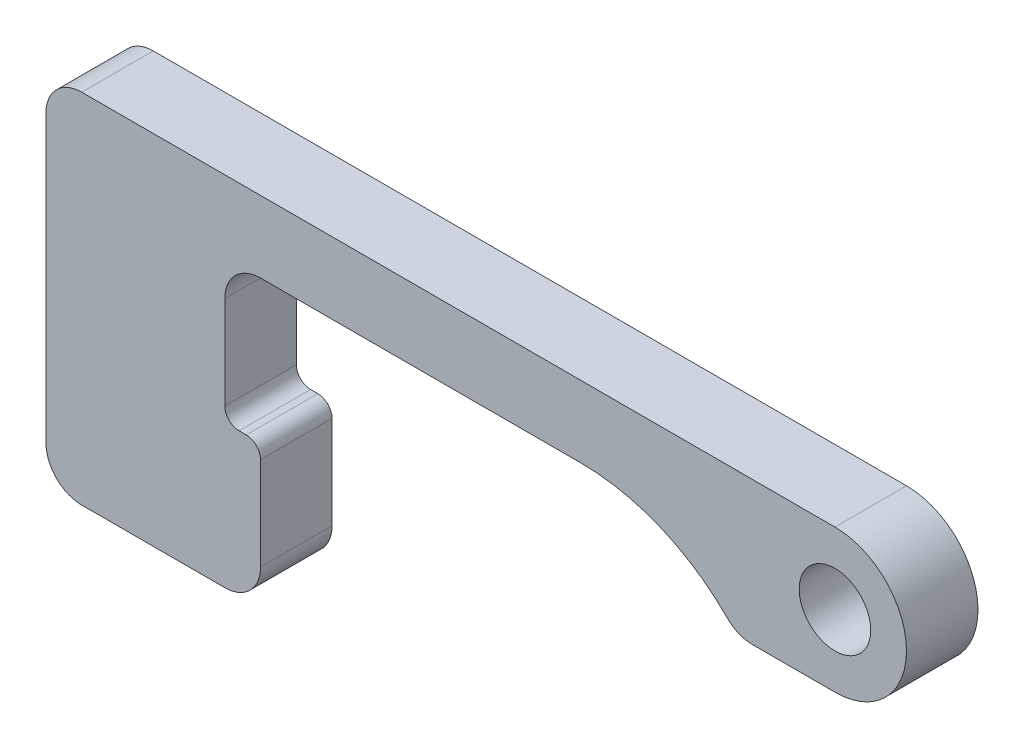
ISO-10303-21;
HEADER;
FILE_DESCRIPTION(('STEP AP214'),'2;1');
FILE_NAME('part.step','',(''),(''),'','','');
FILE_SCHEMA(('AUTOMOTIVE_DESIGN { 1 0 10303 214 1 1 1 1 }'));
ENDSEC;
DATA;
#1=APPLICATION_CONTEXT('core data for automotive mechanical design processes');
#2=APPLICATION_PROTOCOL_DEFINITION('international standard','automotive_design',2000,#1);
#3=PRODUCT_CONTEXT('',#1,'mechanical');
#4=PRODUCT('Part','Part','',(#3));
#5=PRODUCT_RELATED_PRODUCT_CATEGORY('part','',(#4));
#6=PRODUCT_DEFINITION_FORMATION('','',#4);
#7=PRODUCT_DEFINITION_CONTEXT('part definition',#1,'design');
#8=PRODUCT_DEFINITION('design','',#6,#7);
#9=PRODUCT_DEFINITION_SHAPE('','',#8);
#10=(LENGTH_UNIT() NAMED_UNIT(*) SI_UNIT(.MILLI.,.METRE.));
#11=(NAMED_UNIT(*) PLANE_ANGLE_UNIT() SI_UNIT($,.RADIAN.));
#12=(NAMED_UNIT(*) SI_UNIT($,.STERADIAN.) SOLID_ANGLE_UNIT());
#13=UNCERTAINTY_MEASURE_WITH_UNIT(LENGTH_MEASURE(1.E-05),#10,'distance_accuracy_value','');
#14=(GEOMETRIC_REPRESENTATION_CONTEXT(3) GLOBAL_UNCERTAINTY_ASSIGNED_CONTEXT((#13)) GLOBAL_UNIT_ASSIGNED_CONTEXT((#10,
#11,#12)) REPRESENTATION_CONTEXT('',''));
#15=CARTESIAN_POINT('',(0.,0.,0.));
#16=DIRECTION('',(0.,0.,1.));
#17=DIRECTION('',(1.,0.,0.));
#18=AXIS2_PLACEMENT_3D('',#15,#16,#17);
#19=CARTESIAN_POINT('',(0.,0.,10.));
#20=DIRECTION('',(0.,0.,1.));
#21=DIRECTION('',(1.,0.,0.));
#22=AXIS2_PLACEMENT_3D('',#19,#20,#21);
#23=PLANE('',#22);
#24=DIRECTION('',(0.,1.,0.));
#25=VECTOR('',#24,1.);
#26=CARTESIAN_POINT('',(-80.3169457006491,-20.,10.));
#27=LINE('',#26,#25);
#28=CARTESIAN_POINT('',(-80.3169457006491,-35.,10.));
#29=VERTEX_POINT('',#28);
#30=CARTESIAN_POINT('',(-80.3169457006491,-22.,10.));
#31=VERTEX_POINT('',#30);
#32=EDGE_CURVE('E222',#29,#31,#27,.T.);
#33=ORIENTED_EDGE('',*,*,#32,.T.);
#34=CARTESIAN_POINT('',(-82.3169457006491,-22.,10.));
#35=DIRECTION('',(0.,0.,1.));
#36=DIRECTION('',(1.,0.,0.));
#37=AXIS2_PLACEMENT_3D('',#34,#35,#36);
#38=CIRCLE('',#37,2.);
#39=CARTESIAN_POINT('',(-82.3169457006491,-20.,10.));
#40=VERTEX_POINT('',#39);
#41=EDGE_CURVE('E280',#31,#40,#38,.T.);
#42=ORIENTED_EDGE('',*,*,#41,.T.);
#43=DIRECTION('',(-1.,0.,0.));
#44=VECTOR('',#43,1.);
#45=CARTESIAN_POINT('',(-85.3169457006491,-20.,10.));
#46=LINE('',#45,#44);
#47=CARTESIAN_POINT('',(-83.3169457006491,-20.,10.));
#48=VERTEX_POINT('',#47);
#49=EDGE_CURVE('E295',#40,#48,#46,.T.);
#50=ORIENTED_EDGE('',*,*,#49,.T.);
#51=CARTESIAN_POINT('',(-83.3169457006491,-18.,10.));
#52=DIRECTION('',(0.,0.,1.));
#53=DIRECTION('',(1.,0.,0.));
#54=AXIS2_PLACEMENT_3D('',#51,#52,#53);
#55=CIRCLE('',#54,2.);
#56=CARTESIAN_POINT('',(-85.3169457006491,-18.,10.));
#57=VERTEX_POINT('',#56);
#58=EDGE_CURVE('E11',#48,#57,#55,.F.);
#59=ORIENTED_EDGE('',*,*,#58,.T.);
#60=DIRECTION('',(0.,1.,0.));
#61=VECTOR('',#60,1.);
#62=CARTESIAN_POINT('',(-85.3169457006491,0.,10.));
#63=LINE('',#62,#61);
#64=CARTESIAN_POINT('',(-85.3169457006491,-4.99999999999999,10.));
#65=VERTEX_POINT('',#64);
#66=EDGE_CURVE('E165',#57,#65,#63,.T.);
#67=ORIENTED_EDGE('',*,*,#66,.T.);
#68=CARTESIAN_POINT('',(-80.3169457006491,-4.99999999999999,10.));
#69=DIRECTION('',(0.,0.,1.));
#70=DIRECTION('',(1.,0.,0.));
#71=AXIS2_PLACEMENT_3D('',#68,#69,#70);
#72=CIRCLE('',#71,5.);
#73=CARTESIAN_POINT('',(-80.3169457006491,0.,10.));
#74=VERTEX_POINT('',#73);
#75=EDGE_CURVE('E161',#65,#74,#72,.F.);
#76=ORIENTED_EDGE('',*,*,#75,.T.);
#77=DIRECTION('',(1.,0.,0.));
#78=VECTOR('',#77,1.);
#79=CARTESIAN_POINT('',(-85.3169457006491,0.,10.));
#80=LINE('',#79,#78);
#81=CARTESIAN_POINT('',(-35.5537132832868,0.,10.));
#82=VERTEX_POINT('',#81);
#83=EDGE_CURVE('E154',#74,#82,#80,.T.);
#84=ORIENTED_EDGE('',*,*,#83,.T.);
#85=CARTESIAN_POINT('',(-35.5537132832868,-28.8705016718932,10.));
#86=DIRECTION('',(0.,0.,-1.));
#87=DIRECTION('',(1.,0.,0.));
#88=AXIS2_PLACEMENT_3D('',#85,#86,#87);
#89=CIRCLE('',#88,28.8705016718932);
#90=CARTESIAN_POINT('',(-15.0715952576336,-8.52378921090821,10.));
#91=VERTEX_POINT('',#90);
#92=EDGE_CURVE('E158',#82,#91,#89,.T.);
#93=ORIENTED_EDGE('',*,*,#92,.T.);
#94=CARTESIAN_POINT('',(-11.5243555424344,-5.,10.));
#95=DIRECTION('',(0.,0.,1.));
#96=DIRECTION('',(1.,0.,0.));
#97=AXIS2_PLACEMENT_3D('',#94,#95,#96);
#98=CIRCLE('',#97,5.);
#99=CARTESIAN_POINT('',(-11.5243555424344,-10.,10.));
#100=VERTEX_POINT('',#99);
#101=EDGE_CURVE('E249',#91,#100,#98,.T.);
#102=ORIENTED_EDGE('',*,*,#101,.T.);
#103=DIRECTION('',(1.,0.,0.));
#104=VECTOR('',#103,1.);
#105=CARTESIAN_POINT('',(0.,-10.,10.));
#106=LINE('',#105,#104);
#107=CARTESIAN_POINT('',(0.,-10.,10.));
#108=VERTEX_POINT('',#107);
#109=EDGE_CURVE('E181',#100,#108,#106,.T.);
#110=ORIENTED_EDGE('',*,*,#109,.T.);
#111=CARTESIAN_POINT('',(0.,0.,10.));
#112=DIRECTION('',(0.,0.,1.));
#113=DIRECTION('',(1.,0.,0.));
#114=AXIS2_PLACEMENT_3D('',#111,#112,#113);
#115=CIRCLE('',#114,10.);
#116=CARTESIAN_POINT('',(0.,10.,10.));
#117=VERTEX_POINT('',#116);
#118=EDGE_CURVE('E183',#108,#117,#115,.T.);
#119=ORIENTED_EDGE('',*,*,#118,.T.);
#120=DIRECTION('',(-1.,0.,0.));
#121=VECTOR('',#120,1.);
#122=CARTESIAN_POINT('',(-110.316945700649,10.,10.));
#123=LINE('',#122,#121);
#124=CARTESIAN_POINT('',(-105.316945700649,10.,10.));
#125=VERTEX_POINT('',#124);
#126=EDGE_CURVE('E188',#117,#125,#123,.T.);
#127=ORIENTED_EDGE('',*,*,#126,.T.);
#128=CARTESIAN_POINT('',(-105.316945700649,5.,10.));
#129=DIRECTION('',(0.,0.,1.));
#130=DIRECTION('',(1.,0.,0.));
#131=AXIS2_PLACEMENT_3D('',#128,#129,#130);
#132=CIRCLE('',#131,5.);
#133=CARTESIAN_POINT('',(-110.316945700649,4.99999999999999,10.));
#134=VERTEX_POINT('',#133);
#135=EDGE_CURVE('E247',#125,#134,#132,.T.);
#136=ORIENTED_EDGE('',*,*,#135,.T.);
#137=DIRECTION('',(0.,-1.,0.));
#138=VECTOR('',#137,1.);
#139=CARTESIAN_POINT('',(-110.316945700649,-40.,10.));
#140=LINE('',#139,#138);
#141=CARTESIAN_POINT('',(-110.316945700649,-35.,10.));
#142=VERTEX_POINT('',#141);
#143=EDGE_CURVE('E191',#134,#142,#140,.T.);
#144=ORIENTED_EDGE('',*,*,#143,.T.);
#145=CARTESIAN_POINT('',(-105.316945700649,-35.,10.));
#146=DIRECTION('',(0.,0.,1.));
#147=DIRECTION('',(1.,0.,0.));
#148=AXIS2_PLACEMENT_3D('',#145,#146,#147);
#149=CIRCLE('',#148,5.);
#150=CARTESIAN_POINT('',(-105.316945700649,-40.,10.));
#151=VERTEX_POINT('',#150);
#152=EDGE_CURVE('E243',#142,#151,#149,.T.);
#153=ORIENTED_EDGE('',*,*,#152,.T.);
#154=DIRECTION('',(1.,0.,0.));
#155=VECTOR('',#154,1.);
#156=CARTESIAN_POINT('',(-80.3169457006491,-40.,10.));
#157=LINE('',#156,#155);
#158=CARTESIAN_POINT('',(-85.3169457006491,-40.,10.));
#159=VERTEX_POINT('',#158);
#160=EDGE_CURVE('E194',#151,#159,#157,.T.);
#161=ORIENTED_EDGE('',*,*,#160,.T.);
#162=CARTESIAN_POINT('',(-85.3169457006491,-35.,10.));
#163=DIRECTION('',(0.,0.,1.));
#164=DIRECTION('',(1.,0.,0.));
#165=AXIS2_PLACEMENT_3D('',#162,#163,#164);
#166=CIRCLE('',#165,5.);
#167=EDGE_CURVE('E245',#159,#29,#166,.T.);
#168=ORIENTED_EDGE('',*,*,#167,.T.);
#169=EDGE_LOOP('',(#33,#42,#50,#59,#67,#76,#84,#93,#102,#110,#119,#127,#136,#144,#153,#161,#168));
#170=FACE_BOUND('',#169,.T.);
#171=CARTESIAN_POINT('',(0.,0.,10.));
#172=DIRECTION('',(0.,0.,1.));
#173=DIRECTION('',(1.,0.,0.));
#174=AXIS2_PLACEMENT_3D('',#171,#172,#173);
#175=CIRCLE('',#174,4.99999999999999);
#176=CARTESIAN_POINT('',(4.99999999999999,0.,10.));
#177=VERTEX_POINT('',#176);
#178=EDGE_CURVE('E201',#177,#177,#175,.T.);
#179=ORIENTED_EDGE('',*,*,#178,.F.);
#180=EDGE_LOOP('',(#179));
#181=FACE_BOUND('',#180,.T.);
#182=ADVANCED_FACE('F34',(#170,#181),#23,.T.);
#183=CARTESIAN_POINT('',(0.,0.,0.));
#184=DIRECTION('',(0.,0.,1.));
#185=DIRECTION('',(1.,0.,0.));
#186=AXIS2_PLACEMENT_3D('',#183,#184,#185);
#187=PLANE('',#186);
#188=DIRECTION('',(-1.,0.,0.));
#189=VECTOR('',#188,1.);
#190=CARTESIAN_POINT('',(-85.3169457006491,-20.,0.));
#191=LINE('',#190,#189);
#192=CARTESIAN_POINT('',(-82.3169457006491,-20.,0.));
#193=VERTEX_POINT('',#192);
#194=CARTESIAN_POINT('',(-83.3169457006491,-20.,0.));
#195=VERTEX_POINT('',#194);
#196=EDGE_CURVE('E200',#193,#195,#191,.T.);
#197=ORIENTED_EDGE('',*,*,#196,.F.);
#198=CARTESIAN_POINT('',(-82.3169457006491,-22.,0.));
#199=DIRECTION('',(0.,0.,1.));
#200=DIRECTION('',(1.,0.,0.));
#201=AXIS2_PLACEMENT_3D('',#198,#199,#200);
#202=CIRCLE('',#201,2.);
#203=CARTESIAN_POINT('',(-80.3169457006491,-22.,0.));
#204=VERTEX_POINT('',#203);
#205=EDGE_CURVE('E57',#193,#204,#202,.F.);
#206=ORIENTED_EDGE('',*,*,#205,.T.);
#207=DIRECTION('',(0.,1.,0.));
#208=VECTOR('',#207,1.);
#209=CARTESIAN_POINT('',(-80.3169457006491,-20.,0.));
#210=LINE('',#209,#208);
#211=CARTESIAN_POINT('',(-80.3169457006491,-35.,0.));
#212=VERTEX_POINT('',#211);
#213=EDGE_CURVE('E198',#212,#204,#210,.T.);
#214=ORIENTED_EDGE('',*,*,#213,.F.);
#215=CARTESIAN_POINT('',(-85.3169457006491,-35.,0.));
#216=DIRECTION('',(0.,0.,1.));
#217=DIRECTION('',(1.,0.,0.));
#218=AXIS2_PLACEMENT_3D('',#215,#216,#217);
#219=CIRCLE('',#218,5.);
#220=CARTESIAN_POINT('',(-85.3169457006491,-40.,0.));
#221=VERTEX_POINT('',#220);
#222=EDGE_CURVE('E236',#212,#221,#219,.F.);
#223=ORIENTED_EDGE('',*,*,#222,.T.);
#224=DIRECTION('',(1.,0.,0.));
#225=VECTOR('',#224,1.);
#226=CARTESIAN_POINT('',(-80.3169457006491,-40.,0.));
#227=LINE('',#226,#225);
#228=CARTESIAN_POINT('',(-105.316945700649,-40.,0.));
#229=VERTEX_POINT('',#228);
#230=EDGE_CURVE('E219',#229,#221,#227,.T.);
#231=ORIENTED_EDGE('',*,*,#230,.F.);
#232=CARTESIAN_POINT('',(-105.316945700649,-35.,0.));
#233=DIRECTION('',(0.,0.,1.));
#234=DIRECTION('',(1.,0.,0.));
#235=AXIS2_PLACEMENT_3D('',#232,#233,#234);
#236=CIRCLE('',#235,5.);
#237=CARTESIAN_POINT('',(-110.316945700649,-35.,0.));
#238=VERTEX_POINT('',#237);
#239=EDGE_CURVE('E234',#229,#238,#236,.F.);
#240=ORIENTED_EDGE('',*,*,#239,.T.);
#241=DIRECTION('',(0.,-1.,0.));
#242=VECTOR('',#241,1.);
#243=CARTESIAN_POINT('',(-110.316945700649,-40.,0.));
#244=LINE('',#243,#242);
#245=CARTESIAN_POINT('',(-110.316945700649,4.99999999999999,0.));
#246=VERTEX_POINT('',#245);
#247=EDGE_CURVE('E216',#246,#238,#244,.T.);
#248=ORIENTED_EDGE('',*,*,#247,.F.);
#249=CARTESIAN_POINT('',(-105.316945700649,5.,0.));
#250=DIRECTION('',(0.,0.,1.));
#251=DIRECTION('',(1.,0.,0.));
#252=AXIS2_PLACEMENT_3D('',#249,#250,#251);
#253=CIRCLE('',#252,5.);
#254=CARTESIAN_POINT('',(-105.316945700649,10.,0.));
#255=VERTEX_POINT('',#254);
#256=EDGE_CURVE('E238',#246,#255,#253,.F.);
#257=ORIENTED_EDGE('',*,*,#256,.T.);
#258=DIRECTION('',(-1.,0.,0.));
#259=VECTOR('',#258,1.);
#260=CARTESIAN_POINT('',(-110.316945700649,10.,0.));
#261=LINE('',#260,#259);
#262=CARTESIAN_POINT('',(0.,10.,0.));
#263=VERTEX_POINT('',#262);
#264=EDGE_CURVE('E213',#263,#255,#261,.T.);
#265=ORIENTED_EDGE('',*,*,#264,.F.);
#266=CARTESIAN_POINT('',(0.,0.,0.));
#267=DIRECTION('',(0.,0.,1.));
#268=DIRECTION('',(1.,0.,0.));
#269=AXIS2_PLACEMENT_3D('',#266,#267,#268);
#270=CIRCLE('',#269,10.);
#271=CARTESIAN_POINT('',(0.,-10.,0.));
#272=VERTEX_POINT('',#271);
#273=EDGE_CURVE('E211',#272,#263,#270,.T.);
#274=ORIENTED_EDGE('',*,*,#273,.F.);
#275=DIRECTION('',(1.,0.,0.));
#276=VECTOR('',#275,1.);
#277=CARTESIAN_POINT('',(0.,-10.,0.));
#278=LINE('',#277,#276);
#279=CARTESIAN_POINT('',(-11.5243555424344,-10.,0.));
#280=VERTEX_POINT('',#279);
#281=EDGE_CURVE('E209',#280,#272,#278,.T.);
#282=ORIENTED_EDGE('',*,*,#281,.F.);
#283=CARTESIAN_POINT('',(-11.5243555424344,-5.,0.));
#284=DIRECTION('',(0.,0.,1.));
#285=DIRECTION('',(1.,0.,0.));
#286=AXIS2_PLACEMENT_3D('',#283,#284,#285);
#287=CIRCLE('',#286,5.);
#288=CARTESIAN_POINT('',(-15.0715952576336,-8.52378921090821,0.));
#289=VERTEX_POINT('',#288);
#290=EDGE_CURVE('E240',#280,#289,#287,.F.);
#291=ORIENTED_EDGE('',*,*,#290,.T.);
#292=CARTESIAN_POINT('',(-35.5537132832868,-28.8705016718932,0.));
#293=DIRECTION('',(0.,0.,-1.));
#294=DIRECTION('',(1.,0.,0.));
#295=AXIS2_PLACEMENT_3D('',#292,#293,#294);
#296=CIRCLE('',#295,28.8705016718932);
#297=CARTESIAN_POINT('',(-35.5537132832868,0.,0.));
#298=VERTEX_POINT('',#297);
#299=EDGE_CURVE('E207',#298,#289,#296,.T.);
#300=ORIENTED_EDGE('',*,*,#299,.F.);
#301=DIRECTION('',(1.,0.,0.));
#302=VECTOR('',#301,1.);
#303=CARTESIAN_POINT('',(-85.3169457006491,0.,0.));
#304=LINE('',#303,#302);
#305=CARTESIAN_POINT('',(-80.3169457006491,0.,0.));
#306=VERTEX_POINT('',#305);
#307=EDGE_CURVE('E171',#306,#298,#304,.T.);
#308=ORIENTED_EDGE('',*,*,#307,.F.);
#309=CARTESIAN_POINT('',(-80.3169457006491,-4.99999999999999,0.));
#310=DIRECTION('',(0.,0.,1.));
#311=DIRECTION('',(1.,0.,0.));
#312=AXIS2_PLACEMENT_3D('',#309,#310,#311);
#313=CIRCLE('',#312,5.);
#314=CARTESIAN_POINT('',(-85.3169457006491,-4.99999999999999,0.));
#315=VERTEX_POINT('',#314);
#316=EDGE_CURVE('E266',#306,#315,#313,.T.);
#317=ORIENTED_EDGE('',*,*,#316,.T.);
#318=DIRECTION('',(0.,1.,0.));
#319=VECTOR('',#318,1.);
#320=CARTESIAN_POINT('',(-85.3169457006491,0.,0.));
#321=LINE('',#320,#319);
#322=CARTESIAN_POINT('',(-85.3169457006491,-18.,0.));
#323=VERTEX_POINT('',#322);
#324=EDGE_CURVE('E204',#323,#315,#321,.T.);
#325=ORIENTED_EDGE('',*,*,#324,.F.);
#326=CARTESIAN_POINT('',(-83.3169457006491,-18.,0.));
#327=DIRECTION('',(0.,0.,1.));
#328=DIRECTION('',(1.,0.,0.));
#329=AXIS2_PLACEMENT_3D('',#326,#327,#328);
#330=CIRCLE('',#329,2.);
#331=EDGE_CURVE('E42',#323,#195,#330,.T.);
#332=ORIENTED_EDGE('',*,*,#331,.T.);
#333=EDGE_LOOP('',(#197,#206,#214,#223,#231,#240,#248,#257,#265,#274,#282,#291,#300,#308,#317,
#325,#332));
#334=FACE_BOUND('',#333,.T.);
#335=CARTESIAN_POINT('',(0.,0.,0.));
#336=DIRECTION('',(0.,0.,1.));
#337=DIRECTION('',(1.,0.,0.));
#338=AXIS2_PLACEMENT_3D('',#335,#336,#337);
#339=CIRCLE('',#338,4.99999999999999);
#340=CARTESIAN_POINT('',(4.99999999999999,0.,0.));
#341=VERTEX_POINT('',#340);
#342=EDGE_CURVE('E302',#341,#341,#339,.T.);
#343=ORIENTED_EDGE('',*,*,#342,.T.);
#344=EDGE_LOOP('',(#343));
#345=FACE_BOUND('',#344,.T.);
#346=ADVANCED_FACE('F282',(#334,#345),#187,.F.);
#347=CARTESIAN_POINT('',(-80.3169457006491,-20.,10.));
#348=DIRECTION('',(-1.,0.,0.));
#349=DIRECTION('',(0.,0.,1.));
#350=AXIS2_PLACEMENT_3D('',#347,#348,#349);
#351=PLANE('',#350);
#352=ORIENTED_EDGE('',*,*,#213,.T.);
#353=DIRECTION('',(0.,0.,-1.));
#354=VECTOR('',#353,1.);
#355=CARTESIAN_POINT('',(-80.3169457006491,-22.,10.));
#356=LINE('',#355,#354);
#357=EDGE_CURVE('E49',#204,#31,#356,.F.);
#358=ORIENTED_EDGE('',*,*,#357,.T.);
#359=ORIENTED_EDGE('',*,*,#32,.F.);
#360=DIRECTION('',(0.,0.,-1.));
#361=VECTOR('',#360,1.);
#362=CARTESIAN_POINT('',(-80.3169457006491,-35.,10.));
#363=LINE('',#362,#361);
#364=EDGE_CURVE('E258',#29,#212,#363,.T.);
#365=ORIENTED_EDGE('',*,*,#364,.T.);
#366=EDGE_LOOP('',(#352,#358,#359,#365));
#367=FACE_BOUND('',#366,.T.);
#368=ADVANCED_FACE('F315',(#367),#351,.F.);
#369=CARTESIAN_POINT('',(-85.3169457006491,-20.,10.));
#370=DIRECTION('',(0.,-1.,0.));
#371=DIRECTION('',(0.,0.,-1.));
#372=AXIS2_PLACEMENT_3D('',#369,#370,#371);
#373=PLANE('',#372);
#374=ORIENTED_EDGE('',*,*,#196,.T.);
#375=DIRECTION('',(0.,0.,-1.));
#376=VECTOR('',#375,1.);
#377=CARTESIAN_POINT('',(-83.3169457006491,-20.,10.));
#378=LINE('',#377,#376);
#379=EDGE_CURVE('E276',#195,#48,#378,.F.);
#380=ORIENTED_EDGE('',*,*,#379,.T.);
#381=ORIENTED_EDGE('',*,*,#49,.F.);
#382=DIRECTION('',(0.,0.,-1.));
#383=VECTOR('',#382,1.);
#384=CARTESIAN_POINT('',(-82.3169457006491,-20.,10.));
#385=LINE('',#384,#383);
#386=EDGE_CURVE('E273',#40,#193,#385,.T.);
#387=ORIENTED_EDGE('',*,*,#386,.T.);
#388=EDGE_LOOP('',(#374,#380,#381,#387));
#389=FACE_BOUND('',#388,.T.);
#390=ADVANCED_FACE('F288',(#389),#373,.F.);
#391=CARTESIAN_POINT('',(-85.3169457006491,0.,10.));
#392=DIRECTION('',(-1.,0.,0.));
#393=DIRECTION('',(0.,0.,1.));
#394=AXIS2_PLACEMENT_3D('',#391,#392,#393);
#395=PLANE('',#394);
#396=ORIENTED_EDGE('',*,*,#66,.F.);
#397=DIRECTION('',(0.,0.,-1.));
#398=VECTOR('',#397,1.);
#399=CARTESIAN_POINT('',(-85.3169457006491,-18.,0.));
#400=LINE('',#399,#398);
#401=EDGE_CURVE('E270',#57,#323,#400,.T.);
#402=ORIENTED_EDGE('',*,*,#401,.T.);
#403=ORIENTED_EDGE('',*,*,#324,.T.);
#404=DIRECTION('',(0.,0.,-1.));
#405=VECTOR('',#404,1.);
#406=CARTESIAN_POINT('',(-85.3169457006491,-4.99999999999999,10.));
#407=LINE('',#406,#405);
#408=EDGE_CURVE('E228',#315,#65,#407,.F.);
#409=ORIENTED_EDGE('',*,*,#408,.T.);
#410=EDGE_LOOP('',(#396,#402,#403,#409));
#411=FACE_BOUND('',#410,.T.);
#412=ADVANCED_FACE('F297',(#411),#395,.F.);
#413=CARTESIAN_POINT('',(-85.3169457006491,0.,10.));
#414=DIRECTION('',(0.,1.,0.));
#415=DIRECTION('',(0.,0.,1.));
#416=AXIS2_PLACEMENT_3D('',#413,#414,#415);
#417=PLANE('',#416);
#418=ORIENTED_EDGE('',*,*,#83,.F.);
#419=DIRECTION('',(0.,0.,-1.));
#420=VECTOR('',#419,1.);
#421=CARTESIAN_POINT('',(-80.3169457006491,0.,0.));
#422=LINE('',#421,#420);
#423=EDGE_CURVE('E175',#74,#306,#422,.T.);
#424=ORIENTED_EDGE('',*,*,#423,.T.);
#425=ORIENTED_EDGE('',*,*,#307,.T.);
#426=DIRECTION('',(0.,0.,-1.));
#427=VECTOR('',#426,1.);
#428=CARTESIAN_POINT('',(-35.5537132832868,0.,10.));
#429=LINE('',#428,#427);
#430=EDGE_CURVE('E168',#82,#298,#429,.T.);
#431=ORIENTED_EDGE('',*,*,#430,.F.);
#432=EDGE_LOOP('',(#418,#424,#425,#431));
#433=FACE_BOUND('',#432,.T.);
#434=ADVANCED_FACE('F169',(#433),#417,.F.);
#435=CARTESIAN_POINT('',(-35.5537132832868,-28.8705016718932,10.));
#436=DIRECTION('',(0.,0.,-1.));
#437=DIRECTION('',(-1.,0.,0.));
#438=AXIS2_PLACEMENT_3D('',#435,#436,#437);
#439=CYLINDRICAL_SURFACE('',#438,28.8705016718932);
#440=ORIENTED_EDGE('',*,*,#299,.T.);
#441=DIRECTION('',(0.,0.,-1.));
#442=VECTOR('',#441,1.);
#443=CARTESIAN_POINT('',(-15.0715952576336,-8.52378921090822,10.));
#444=LINE('',#443,#442);
#445=EDGE_CURVE('E180',#289,#91,#444,.F.);
#446=ORIENTED_EDGE('',*,*,#445,.T.);
#447=ORIENTED_EDGE('',*,*,#92,.F.);
#448=ORIENTED_EDGE('',*,*,#430,.T.);
#449=EDGE_LOOP('',(#440,#446,#447,#448));
#450=FACE_BOUND('',#449,.T.);
#451=ADVANCED_FACE('F178',(#450),#439,.F.);
#452=CARTESIAN_POINT('',(0.,-10.,10.));
#453=DIRECTION('',(0.,1.,0.));
#454=DIRECTION('',(0.,0.,1.));
#455=AXIS2_PLACEMENT_3D('',#452,#453,#454);
#456=PLANE('',#455);
#457=ORIENTED_EDGE('',*,*,#109,.F.);
#458=DIRECTION('',(0.,0.,-1.));
#459=VECTOR('',#458,1.);
#460=CARTESIAN_POINT('',(-11.5243555424344,-10.,10.));
#461=LINE('',#460,#459);
#462=EDGE_CURVE('E231',#100,#280,#461,.T.);
#463=ORIENTED_EDGE('',*,*,#462,.T.);
#464=ORIENTED_EDGE('',*,*,#281,.T.);
#465=DIRECTION('',(0.,0.,-1.));
#466=VECTOR('',#465,1.);
#467=CARTESIAN_POINT('',(0.,-10.,10.));
#468=LINE('',#467,#466);
#469=EDGE_CURVE('E176',#108,#272,#468,.T.);
#470=ORIENTED_EDGE('',*,*,#469,.F.);
#471=EDGE_LOOP('',(#457,#463,#464,#470));
#472=FACE_BOUND('',#471,.T.);
#473=ADVANCED_FACE('F334',(#472),#456,.F.);
#474=CARTESIAN_POINT('',(0.,0.,10.));
#475=DIRECTION('',(0.,0.,-1.));
#476=DIRECTION('',(-1.,0.,0.));
#477=AXIS2_PLACEMENT_3D('',#474,#475,#476);
#478=CYLINDRICAL_SURFACE('',#477,10.);
#479=ORIENTED_EDGE('',*,*,#273,.T.);
#480=DIRECTION('',(0.,0.,-1.));
#481=VECTOR('',#480,1.);
#482=CARTESIAN_POINT('',(0.,10.,10.));
#483=LINE('',#482,#481);
#484=EDGE_CURVE('E197',#117,#263,#483,.T.);
#485=ORIENTED_EDGE('',*,*,#484,.F.);
#486=ORIENTED_EDGE('',*,*,#118,.F.);
#487=ORIENTED_EDGE('',*,*,#469,.T.);
#488=EDGE_LOOP('',(#479,#485,#486,#487));
#489=FACE_BOUND('',#488,.T.);
#490=ADVANCED_FACE('F330',(#489),#478,.T.);
#491=CARTESIAN_POINT('',(-110.316945700649,10.,10.));
#492=DIRECTION('',(0.,-1.,0.));
#493=DIRECTION('',(0.,0.,-1.));
#494=AXIS2_PLACEMENT_3D('',#491,#492,#493);
#495=PLANE('',#494);
#496=ORIENTED_EDGE('',*,*,#264,.T.);
#497=DIRECTION('',(0.,0.,-1.));
#498=VECTOR('',#497,1.);
#499=CARTESIAN_POINT('',(-105.316945700649,10.,10.));
#500=LINE('',#499,#498);
#501=EDGE_CURVE('E256',#255,#125,#500,.F.);
#502=ORIENTED_EDGE('',*,*,#501,.T.);
#503=ORIENTED_EDGE('',*,*,#126,.F.);
#504=ORIENTED_EDGE('',*,*,#484,.T.);
#505=EDGE_LOOP('',(#496,#502,#503,#504));
#506=FACE_BOUND('',#505,.T.);
#507=ADVANCED_FACE('F326',(#506),#495,.F.);
#508=CARTESIAN_POINT('',(-110.316945700649,-40.,10.));
#509=DIRECTION('',(1.,0.,0.));
#510=DIRECTION('',(0.,0.,-1.));
#511=AXIS2_PLACEMENT_3D('',#508,#509,#510);
#512=PLANE('',#511);
#513=ORIENTED_EDGE('',*,*,#143,.F.);
#514=DIRECTION('',(0.,0.,-1.));
#515=VECTOR('',#514,1.);
#516=CARTESIAN_POINT('',(-110.316945700649,5.,10.));
#517=LINE('',#516,#515);
#518=EDGE_CURVE('E253',#134,#246,#517,.T.);
#519=ORIENTED_EDGE('',*,*,#518,.T.);
#520=ORIENTED_EDGE('',*,*,#247,.T.);
#521=DIRECTION('',(0.,0.,-1.));
#522=VECTOR('',#521,1.);
#523=CARTESIAN_POINT('',(-110.316945700649,-35.,10.));
#524=LINE('',#523,#522);
#525=EDGE_CURVE('E251',#238,#142,#524,.F.);
#526=ORIENTED_EDGE('',*,*,#525,.T.);
#527=EDGE_LOOP('',(#513,#519,#520,#526));
#528=FACE_BOUND('',#527,.T.);
#529=ADVANCED_FACE('F322',(#528),#512,.F.);
#530=CARTESIAN_POINT('',(-80.3169457006491,-40.,10.));
#531=DIRECTION('',(0.,1.,0.));
#532=DIRECTION('',(0.,0.,1.));
#533=AXIS2_PLACEMENT_3D('',#530,#531,#532);
#534=PLANE('',#533);
#535=ORIENTED_EDGE('',*,*,#230,.T.);
#536=DIRECTION('',(0.,0.,-1.));
#537=VECTOR('',#536,1.);
#538=CARTESIAN_POINT('',(-85.3169457006491,-40.,10.));
#539=LINE('',#538,#537);
#540=EDGE_CURVE('E264',#221,#159,#539,.F.);
#541=ORIENTED_EDGE('',*,*,#540,.T.);
#542=ORIENTED_EDGE('',*,*,#160,.F.);
#543=DIRECTION('',(0.,0.,-1.));
#544=VECTOR('',#543,1.);
#545=CARTESIAN_POINT('',(-105.316945700649,-40.,10.));
#546=LINE('',#545,#544);
#547=EDGE_CURVE('E261',#151,#229,#546,.T.);
#548=ORIENTED_EDGE('',*,*,#547,.T.);
#549=EDGE_LOOP('',(#535,#541,#542,#548));
#550=FACE_BOUND('',#549,.T.);
#551=ADVANCED_FACE('F319',(#550),#534,.F.);
#552=CARTESIAN_POINT('',(0.,0.,10.));
#553=DIRECTION('',(0.,0.,-1.));
#554=DIRECTION('',(-1.,0.,0.));
#555=AXIS2_PLACEMENT_3D('',#552,#553,#554);
#556=CYLINDRICAL_SURFACE('',#555,4.99999999999999);
#557=ORIENTED_EDGE('',*,*,#178,.T.);
#558=EDGE_LOOP('',(#557));
#559=FACE_BOUND('',#558,.T.);
#560=ORIENTED_EDGE('',*,*,#342,.F.);
#561=EDGE_LOOP('',(#560));
#562=FACE_BOUND('',#561,.T.);
#563=ADVANCED_FACE('F308',(#559,#562),#556,.F.);
#564=CARTESIAN_POINT('',(-80.3169457006491,-4.99999999999999,10.));
#565=DIRECTION('',(0.,0.,1.));
#566=DIRECTION('',(1.,0.,0.));
#567=AXIS2_PLACEMENT_3D('',#564,#565,#566);
#568=CYLINDRICAL_SURFACE('',#567,5.);
#569=ORIENTED_EDGE('',*,*,#75,.F.);
#570=ORIENTED_EDGE('',*,*,#408,.F.);
#571=ORIENTED_EDGE('',*,*,#316,.F.);
#572=ORIENTED_EDGE('',*,*,#423,.F.);
#573=EDGE_LOOP('',(#569,#570,#571,#572));
#574=FACE_BOUND('',#573,.T.);
#575=ADVANCED_FACE('F349',(#574),#568,.F.);
#576=CARTESIAN_POINT('',(-11.5243555424344,-5.,10.));
#577=DIRECTION('',(0.,0.,-1.));
#578=DIRECTION('',(-1.,0.,0.));
#579=AXIS2_PLACEMENT_3D('',#576,#577,#578);
#580=CYLINDRICAL_SURFACE('',#579,5.);
#581=ORIENTED_EDGE('',*,*,#101,.F.);
#582=ORIENTED_EDGE('',*,*,#445,.F.);
#583=ORIENTED_EDGE('',*,*,#290,.F.);
#584=ORIENTED_EDGE('',*,*,#462,.F.);
#585=EDGE_LOOP('',(#581,#582,#583,#584));
#586=FACE_BOUND('',#585,.T.);
#587=ADVANCED_FACE('F352',(#586),#580,.T.);
#588=CARTESIAN_POINT('',(-105.316945700649,5.,10.));
#589=DIRECTION('',(0.,0.,-1.));
#590=DIRECTION('',(-1.,0.,0.));
#591=AXIS2_PLACEMENT_3D('',#588,#589,#590);
#592=CYLINDRICAL_SURFACE('',#591,5.);
#593=ORIENTED_EDGE('',*,*,#135,.F.);
#594=ORIENTED_EDGE('',*,*,#501,.F.);
#595=ORIENTED_EDGE('',*,*,#256,.F.);
#596=ORIENTED_EDGE('',*,*,#518,.F.);
#597=EDGE_LOOP('',(#593,#594,#595,#596));
#598=FACE_BOUND('',#597,.T.);
#599=ADVANCED_FACE('F356',(#598),#592,.T.);
#600=CARTESIAN_POINT('',(-85.3169457006491,-35.,10.));
#601=DIRECTION('',(0.,0.,-1.));
#602=DIRECTION('',(-1.,0.,0.));
#603=AXIS2_PLACEMENT_3D('',#600,#601,#602);
#604=CYLINDRICAL_SURFACE('',#603,5.);
#605=ORIENTED_EDGE('',*,*,#167,.F.);
#606=ORIENTED_EDGE('',*,*,#540,.F.);
#607=ORIENTED_EDGE('',*,*,#222,.F.);
#608=ORIENTED_EDGE('',*,*,#364,.F.);
#609=EDGE_LOOP('',(#605,#606,#607,#608));
#610=FACE_BOUND('',#609,.T.);
#611=ADVANCED_FACE('F360',(#610),#604,.T.);
#612=CARTESIAN_POINT('',(-105.316945700649,-35.,10.));
#613=DIRECTION('',(0.,0.,-1.));
#614=DIRECTION('',(-1.,0.,0.));
#615=AXIS2_PLACEMENT_3D('',#612,#613,#614);
#616=CYLINDRICAL_SURFACE('',#615,5.);
#617=ORIENTED_EDGE('',*,*,#152,.F.);
#618=ORIENTED_EDGE('',*,*,#525,.F.);
#619=ORIENTED_EDGE('',*,*,#239,.F.);
#620=ORIENTED_EDGE('',*,*,#547,.F.);
#621=EDGE_LOOP('',(#617,#618,#619,#620));
#622=FACE_BOUND('',#621,.T.);
#623=ADVANCED_FACE('F364',(#622),#616,.T.);
#624=CARTESIAN_POINT('',(-83.3169457006491,-18.,10.));
#625=DIRECTION('',(0.,0.,1.));
#626=DIRECTION('',(1.,0.,0.));
#627=AXIS2_PLACEMENT_3D('',#624,#625,#626);
#628=CYLINDRICAL_SURFACE('',#627,2.);
#629=ORIENTED_EDGE('',*,*,#58,.F.);
#630=ORIENTED_EDGE('',*,*,#379,.F.);
#631=ORIENTED_EDGE('',*,*,#331,.F.);
#632=ORIENTED_EDGE('',*,*,#401,.F.);
#633=EDGE_LOOP('',(#629,#630,#631,#632));
#634=FACE_BOUND('',#633,.T.);
#635=ADVANCED_FACE('F293',(#634),#628,.F.);
#636=CARTESIAN_POINT('',(-82.3169457006491,-22.,10.));
#637=DIRECTION('',(0.,0.,-1.));
#638=DIRECTION('',(-1.,0.,0.));
#639=AXIS2_PLACEMENT_3D('',#636,#637,#638);
#640=CYLINDRICAL_SURFACE('',#639,2.);
#641=ORIENTED_EDGE('',*,*,#41,.F.);
#642=ORIENTED_EDGE('',*,*,#357,.F.);
#643=ORIENTED_EDGE('',*,*,#205,.F.);
#644=ORIENTED_EDGE('',*,*,#386,.F.);
#645=EDGE_LOOP('',(#641,#642,#643,#644));
#646=FACE_BOUND('',#645,.T.);
#647=ADVANCED_FACE('F36',(#646),#640,.T.);
#648=CLOSED_SHELL('',(#182,#346,#368,#390,#412,#434,#451,#473,#490,#507,#529,#551,#563,#575,
#587,#599,#611,#623,#635,#647));
#649=MANIFOLD_SOLID_BREP('B2',#648);
#650=ADVANCED_BREP_SHAPE_REPRESENTATION('',(#18,#649),#14);
#651=SHAPE_DEFINITION_REPRESENTATION(#9,#650);
ENDSEC;
END-ISO-10303-21;
